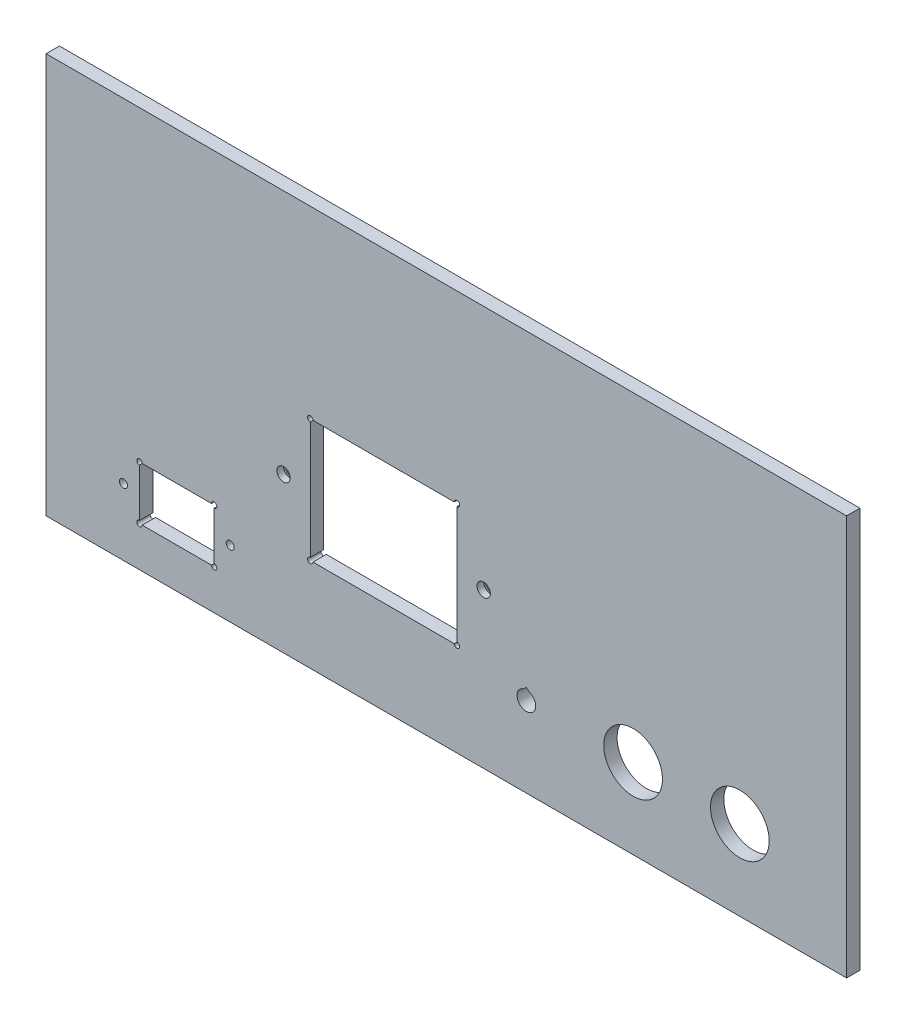
ISO-10303-21;
HEADER;
FILE_DESCRIPTION(('STEP AP214'),'2;1');
FILE_NAME('part.step','',(''),(''),'','','');
FILE_SCHEMA(('AUTOMOTIVE_DESIGN { 1 0 10303 214 1 1 1 1 }'));
ENDSEC;
DATA;
#1=APPLICATION_CONTEXT('core data for automotive mechanical design processes');
#2=APPLICATION_PROTOCOL_DEFINITION('international standard','automotive_design',2000,#1);
#3=PRODUCT_CONTEXT('',#1,'mechanical');
#4=PRODUCT('Part','Part','',(#3));
#5=PRODUCT_RELATED_PRODUCT_CATEGORY('part','',(#4));
#6=PRODUCT_DEFINITION_FORMATION('','',#4);
#7=PRODUCT_DEFINITION_CONTEXT('part definition',#1,'design');
#8=PRODUCT_DEFINITION('design','',#6,#7);
#9=PRODUCT_DEFINITION_SHAPE('','',#8);
#10=(LENGTH_UNIT() NAMED_UNIT(*) SI_UNIT(.MILLI.,.METRE.));
#11=(NAMED_UNIT(*) PLANE_ANGLE_UNIT() SI_UNIT($,.RADIAN.));
#12=(NAMED_UNIT(*) SI_UNIT($,.STERADIAN.) SOLID_ANGLE_UNIT());
#13=UNCERTAINTY_MEASURE_WITH_UNIT(LENGTH_MEASURE(1.E-05),#10,'distance_accuracy_value','');
#14=(GEOMETRIC_REPRESENTATION_CONTEXT(3) GLOBAL_UNCERTAINTY_ASSIGNED_CONTEXT((#13)) GLOBAL_UNIT_ASSIGNED_CONTEXT((#10,
#11,#12)) REPRESENTATION_CONTEXT('',''));
#15=CARTESIAN_POINT('',(0.,0.,0.));
#16=DIRECTION('',(0.,0.,1.));
#17=DIRECTION('',(1.,0.,0.));
#18=AXIS2_PLACEMENT_3D('',#15,#16,#17);
#19=CARTESIAN_POINT('',(150.,75.,5.));
#20=DIRECTION('',(-1.,0.,0.));
#21=DIRECTION('',(0.,-1.,0.));
#22=AXIS2_PLACEMENT_3D('',#19,#20,#21);
#23=PLANE('',#22);
#24=DIRECTION('',(0.,1.,0.));
#25=VECTOR('',#24,1.);
#26=CARTESIAN_POINT('',(150.,75.,0.));
#27=LINE('',#26,#25);
#28=CARTESIAN_POINT('',(150.,-75.,0.));
#29=VERTEX_POINT('',#28);
#30=CARTESIAN_POINT('',(150.,75.,0.));
#31=VERTEX_POINT('',#30);
#32=EDGE_CURVE('E357',#29,#31,#27,.T.);
#33=ORIENTED_EDGE('',*,*,#32,.T.);
#34=DIRECTION('',(0.,0.,-1.));
#35=VECTOR('',#34,1.);
#36=CARTESIAN_POINT('',(150.,75.,5.));
#37=LINE('',#36,#35);
#38=CARTESIAN_POINT('',(150.,75.,5.));
#39=VERTEX_POINT('',#38);
#40=EDGE_CURVE('E393',#39,#31,#37,.T.);
#41=ORIENTED_EDGE('',*,*,#40,.F.);
#42=DIRECTION('',(0.,1.,0.));
#43=VECTOR('',#42,1.);
#44=CARTESIAN_POINT('',(150.,75.,5.));
#45=LINE('',#44,#43);
#46=CARTESIAN_POINT('',(150.,-75.,5.));
#47=VERTEX_POINT('',#46);
#48=EDGE_CURVE('E367',#47,#39,#45,.T.);
#49=ORIENTED_EDGE('',*,*,#48,.F.);
#50=DIRECTION('',(0.,0.,-1.));
#51=VECTOR('',#50,1.);
#52=CARTESIAN_POINT('',(150.,-75.,5.));
#53=LINE('',#52,#51);
#54=EDGE_CURVE('E377',#47,#29,#53,.T.);
#55=ORIENTED_EDGE('',*,*,#54,.T.);
#56=EDGE_LOOP('',(#33,#41,#49,#55));
#57=FACE_BOUND('',#56,.T.);
#58=ADVANCED_FACE('F47',(#57),#23,.F.);
#59=CARTESIAN_POINT('',(-150.,75.,5.));
#60=DIRECTION('',(0.,-1.,0.));
#61=DIRECTION('',(0.,0.,-1.));
#62=AXIS2_PLACEMENT_3D('',#59,#60,#61);
#63=PLANE('',#62);
#64=DIRECTION('',(-1.,0.,0.));
#65=VECTOR('',#64,1.);
#66=CARTESIAN_POINT('',(-150.,75.,0.));
#67=LINE('',#66,#65);
#68=CARTESIAN_POINT('',(-150.,75.,0.));
#69=VERTEX_POINT('',#68);
#70=EDGE_CURVE('E380',#31,#69,#67,.T.);
#71=ORIENTED_EDGE('',*,*,#70,.T.);
#72=DIRECTION('',(0.,0.,-1.));
#73=VECTOR('',#72,1.);
#74=CARTESIAN_POINT('',(-150.,75.,5.));
#75=LINE('',#74,#73);
#76=CARTESIAN_POINT('',(-150.,75.,5.));
#77=VERTEX_POINT('',#76);
#78=EDGE_CURVE('E390',#77,#69,#75,.T.);
#79=ORIENTED_EDGE('',*,*,#78,.F.);
#80=DIRECTION('',(-1.,0.,0.));
#81=VECTOR('',#80,1.);
#82=CARTESIAN_POINT('',(-150.,75.,5.));
#83=LINE('',#82,#81);
#84=EDGE_CURVE('E370',#39,#77,#83,.T.);
#85=ORIENTED_EDGE('',*,*,#84,.F.);
#86=ORIENTED_EDGE('',*,*,#40,.T.);
#87=EDGE_LOOP('',(#71,#79,#85,#86));
#88=FACE_BOUND('',#87,.T.);
#89=ADVANCED_FACE('F450',(#88),#63,.F.);
#90=CARTESIAN_POINT('',(-150.,75.,5.));
#91=DIRECTION('',(1.,0.,0.));
#92=DIRECTION('',(0.,0.,-1.));
#93=AXIS2_PLACEMENT_3D('',#90,#91,#92);
#94=PLANE('',#93);
#95=DIRECTION('',(0.,-1.,0.));
#96=VECTOR('',#95,1.);
#97=CARTESIAN_POINT('',(-150.,75.,0.));
#98=LINE('',#97,#96);
#99=CARTESIAN_POINT('',(-150.,-75.,0.));
#100=VERTEX_POINT('',#99);
#101=EDGE_CURVE('E382',#69,#100,#98,.T.);
#102=ORIENTED_EDGE('',*,*,#101,.T.);
#103=DIRECTION('',(0.,0.,-1.));
#104=VECTOR('',#103,1.);
#105=CARTESIAN_POINT('',(-150.,-75.,5.));
#106=LINE('',#105,#104);
#107=CARTESIAN_POINT('',(-150.,-75.,5.));
#108=VERTEX_POINT('',#107);
#109=EDGE_CURVE('E387',#108,#100,#106,.T.);
#110=ORIENTED_EDGE('',*,*,#109,.F.);
#111=DIRECTION('',(0.,-1.,0.));
#112=VECTOR('',#111,1.);
#113=CARTESIAN_POINT('',(-150.,75.,5.));
#114=LINE('',#113,#112);
#115=EDGE_CURVE('E373',#77,#108,#114,.T.);
#116=ORIENTED_EDGE('',*,*,#115,.F.);
#117=ORIENTED_EDGE('',*,*,#78,.T.);
#118=EDGE_LOOP('',(#102,#110,#116,#117));
#119=FACE_BOUND('',#118,.T.);
#120=ADVANCED_FACE('F456',(#119),#94,.F.);
#121=CARTESIAN_POINT('',(-150.,-75.,5.));
#122=DIRECTION('',(0.,1.,0.));
#123=DIRECTION('',(0.,0.,1.));
#124=AXIS2_PLACEMENT_3D('',#121,#122,#123);
#125=PLANE('',#124);
#126=DIRECTION('',(1.,0.,0.));
#127=VECTOR('',#126,1.);
#128=CARTESIAN_POINT('',(-150.,-75.,0.));
#129=LINE('',#128,#127);
#130=EDGE_CURVE('E371',#100,#29,#129,.T.);
#131=ORIENTED_EDGE('',*,*,#130,.T.);
#132=ORIENTED_EDGE('',*,*,#54,.F.);
#133=DIRECTION('',(1.,0.,0.));
#134=VECTOR('',#133,1.);
#135=CARTESIAN_POINT('',(-150.,-75.,5.));
#136=LINE('',#135,#134);
#137=EDGE_CURVE('E375',#108,#47,#136,.T.);
#138=ORIENTED_EDGE('',*,*,#137,.F.);
#139=ORIENTED_EDGE('',*,*,#109,.T.);
#140=EDGE_LOOP('',(#131,#132,#138,#139));
#141=FACE_BOUND('',#140,.T.);
#142=ADVANCED_FACE('F462',(#141),#125,.F.);
#143=CARTESIAN_POINT('',(0.,0.,5.));
#144=DIRECTION('',(0.,0.,1.));
#145=DIRECTION('',(1.,0.,0.));
#146=AXIS2_PLACEMENT_3D('',#143,#144,#145);
#147=PLANE('',#146);
#148=DIRECTION('',(-0.707106781186548,-0.707106781186548,0.));
#149=VECTOR('',#148,1.);
#150=CARTESIAN_POINT('',(35.3229490168751,-35.3229490168751,5.));
#151=LINE('',#150,#149);
#152=CARTESIAN_POINT('',(30.,-40.6458980337503,5.));
#153=VERTEX_POINT('',#152);
#154=CARTESIAN_POINT('',(29.,-41.6458980337503,5.));
#155=VERTEX_POINT('',#154);
#156=EDGE_CURVE('E62',#153,#155,#151,.T.);
#157=ORIENTED_EDGE('',*,*,#156,.F.);
#158=DIRECTION('',(-0.707106781186548,0.707106781186548,0.));
#159=VECTOR('',#158,1.);
#160=CARTESIAN_POINT('',(-5.32294901687519,-5.32294901687519,5.));
#161=LINE('',#160,#159);
#162=CARTESIAN_POINT('',(31.,-41.6458980337503,5.));
#163=VERTEX_POINT('',#162);
#164=EDGE_CURVE('E204',#163,#153,#161,.T.);
#165=ORIENTED_EDGE('',*,*,#164,.F.);
#166=CARTESIAN_POINT('',(30.,-45.,5.));
#167=DIRECTION('',(0.,0.,1.));
#168=DIRECTION('',(1.,0.,0.));
#169=AXIS2_PLACEMENT_3D('',#166,#167,#168);
#170=CIRCLE('',#169,3.5);
#171=EDGE_CURVE('E226',#155,#163,#170,.T.);
#172=ORIENTED_EDGE('',*,*,#171,.F.);
#173=EDGE_LOOP('',(#157,#165,#172));
#174=FACE_BOUND('',#173,.T.);
#175=CARTESIAN_POINT('',(3.99999999999996,5.99999999999999,5.));
#176=DIRECTION('',(0.,0.,1.));
#177=DIRECTION('',(1.,0.,0.));
#178=AXIS2_PLACEMENT_3D('',#175,#176,#177);
#179=CIRCLE('',#178,1.);
#180=CARTESIAN_POINT('',(3.99999999999996,4.99999999999999,5.));
#181=VERTEX_POINT('',#180);
#182=CARTESIAN_POINT('',(2.99999999999995,5.99999999999999,5.));
#183=VERTEX_POINT('',#182);
#184=EDGE_CURVE('E233',#181,#183,#179,.T.);
#185=ORIENTED_EDGE('',*,*,#184,.F.);
#186=DIRECTION('',(0.,1.,0.));
#187=VECTOR('',#186,1.);
#188=CARTESIAN_POINT('',(3.99999999999996,-40.,5.));
#189=LINE('',#188,#187);
#190=CARTESIAN_POINT('',(3.99999999999996,-39.,5.));
#191=VERTEX_POINT('',#190);
#192=EDGE_CURVE('E285',#191,#181,#189,.T.);
#193=ORIENTED_EDGE('',*,*,#192,.F.);
#194=CARTESIAN_POINT('',(3.99999999999996,-40.,5.));
#195=DIRECTION('',(0.,0.,1.));
#196=DIRECTION('',(1.,0.,0.));
#197=AXIS2_PLACEMENT_3D('',#194,#195,#196);
#198=CIRCLE('',#197,1.);
#199=CARTESIAN_POINT('',(2.99999999999995,-40.,5.));
#200=VERTEX_POINT('',#199);
#201=EDGE_CURVE('E238',#200,#191,#198,.T.);
#202=ORIENTED_EDGE('',*,*,#201,.F.);
#203=DIRECTION('',(1.,0.,0.));
#204=VECTOR('',#203,1.);
#205=CARTESIAN_POINT('',(-51.,-40.,5.));
#206=LINE('',#205,#204);
#207=CARTESIAN_POINT('',(-50.,-40.,5.));
#208=VERTEX_POINT('',#207);
#209=EDGE_CURVE('E282',#208,#200,#206,.T.);
#210=ORIENTED_EDGE('',*,*,#209,.F.);
#211=CARTESIAN_POINT('',(-51.,-40.,5.));
#212=DIRECTION('',(0.,0.,1.));
#213=DIRECTION('',(1.,0.,0.));
#214=AXIS2_PLACEMENT_3D('',#211,#212,#213);
#215=CIRCLE('',#214,0.999999999999998);
#216=CARTESIAN_POINT('',(-51.,-39.,5.));
#217=VERTEX_POINT('',#216);
#218=EDGE_CURVE('E222',#217,#208,#215,.T.);
#219=ORIENTED_EDGE('',*,*,#218,.F.);
#220=DIRECTION('',(0.,-1.,0.));
#221=VECTOR('',#220,1.);
#222=CARTESIAN_POINT('',(-51.,-40.,5.));
#223=LINE('',#222,#221);
#224=CARTESIAN_POINT('',(-51.,4.99999999999999,5.));
#225=VERTEX_POINT('',#224);
#226=EDGE_CURVE('E264',#225,#217,#223,.T.);
#227=ORIENTED_EDGE('',*,*,#226,.F.);
#228=CARTESIAN_POINT('',(-51.,5.99999999999999,5.));
#229=DIRECTION('',(0.,0.,1.));
#230=DIRECTION('',(1.,0.,0.));
#231=AXIS2_PLACEMENT_3D('',#228,#229,#230);
#232=CIRCLE('',#231,0.999999999999998);
#233=CARTESIAN_POINT('',(-50.,5.99999999999999,5.));
#234=VERTEX_POINT('',#233);
#235=EDGE_CURVE('E252',#234,#225,#232,.T.);
#236=ORIENTED_EDGE('',*,*,#235,.F.);
#237=DIRECTION('',(-1.,0.,0.));
#238=VECTOR('',#237,1.);
#239=CARTESIAN_POINT('',(-51.,5.99999999999999,5.));
#240=LINE('',#239,#238);
#241=EDGE_CURVE('E271',#183,#234,#240,.T.);
#242=ORIENTED_EDGE('',*,*,#241,.F.);
#243=EDGE_LOOP('',(#185,#193,#202,#210,#219,#227,#236,#242));
#244=FACE_BOUND('',#243,.T.);
#245=CARTESIAN_POINT('',(-61.0000000000001,-17.,5.));
#246=DIRECTION('',(0.,0.,1.));
#247=DIRECTION('',(1.,0.,0.));
#248=AXIS2_PLACEMENT_3D('',#245,#246,#247);
#249=CIRCLE('',#248,2.5);
#250=CARTESIAN_POINT('',(-58.5,-17.,5.));
#251=VERTEX_POINT('',#250);
#252=EDGE_CURVE('E261',#251,#251,#249,.T.);
#253=ORIENTED_EDGE('',*,*,#252,.F.);
#254=EDGE_LOOP('',(#253));
#255=FACE_BOUND('',#254,.T.);
#256=CARTESIAN_POINT('',(14.,-17.,5.));
#257=DIRECTION('',(0.,0.,1.));
#258=DIRECTION('',(1.,0.,0.));
#259=AXIS2_PLACEMENT_3D('',#256,#257,#258);
#260=CIRCLE('',#259,2.5);
#261=CARTESIAN_POINT('',(16.5,-17.,5.));
#262=VERTEX_POINT('',#261);
#263=EDGE_CURVE('E260',#262,#262,#260,.T.);
#264=ORIENTED_EDGE('',*,*,#263,.F.);
#265=EDGE_LOOP('',(#264));
#266=FACE_BOUND('',#265,.T.);
#267=CARTESIAN_POINT('',(-87.,-40.,5.));
#268=DIRECTION('',(0.,0.,1.));
#269=DIRECTION('',(1.,0.,0.));
#270=AXIS2_PLACEMENT_3D('',#267,#268,#269);
#271=CIRCLE('',#270,0.999999999999998);
#272=CARTESIAN_POINT('',(-87.,-41.,5.));
#273=VERTEX_POINT('',#272);
#274=CARTESIAN_POINT('',(-88.0000000000001,-40.,5.));
#275=VERTEX_POINT('',#274);
#276=EDGE_CURVE('E293',#273,#275,#271,.T.);
#277=ORIENTED_EDGE('',*,*,#276,.F.);
#278=DIRECTION('',(0.,1.,0.));
#279=VECTOR('',#278,1.);
#280=CARTESIAN_POINT('',(-87.,-40.,5.));
#281=LINE('',#280,#279);
#282=CARTESIAN_POINT('',(-87.,-59.,5.));
#283=VERTEX_POINT('',#282);
#284=EDGE_CURVE('E336',#283,#273,#281,.T.);
#285=ORIENTED_EDGE('',*,*,#284,.F.);
#286=CARTESIAN_POINT('',(-87.,-60.,5.));
#287=DIRECTION('',(0.,0.,1.));
#288=DIRECTION('',(1.,0.,0.));
#289=AXIS2_PLACEMENT_3D('',#286,#287,#288);
#290=CIRCLE('',#289,0.999999999999998);
#291=CARTESIAN_POINT('',(-88.0000000000001,-60.,5.));
#292=VERTEX_POINT('',#291);
#293=EDGE_CURVE('E298',#292,#283,#290,.T.);
#294=ORIENTED_EDGE('',*,*,#293,.F.);
#295=DIRECTION('',(1.,0.,0.));
#296=VECTOR('',#295,1.);
#297=CARTESIAN_POINT('',(-115.,-60.,5.));
#298=LINE('',#297,#296);
#299=CARTESIAN_POINT('',(-114.,-60.,5.));
#300=VERTEX_POINT('',#299);
#301=EDGE_CURVE('E349',#300,#292,#298,.T.);
#302=ORIENTED_EDGE('',*,*,#301,.F.);
#303=CARTESIAN_POINT('',(-115.,-60.,5.));
#304=DIRECTION('',(0.,0.,1.));
#305=DIRECTION('',(1.,0.,0.));
#306=AXIS2_PLACEMENT_3D('',#303,#304,#305);
#307=CIRCLE('',#306,0.999999999999998);
#308=CARTESIAN_POINT('',(-115.,-59.,5.));
#309=VERTEX_POINT('',#308);
#310=EDGE_CURVE('E279',#309,#300,#307,.T.);
#311=ORIENTED_EDGE('',*,*,#310,.F.);
#312=DIRECTION('',(0.,-1.,0.));
#313=VECTOR('',#312,1.);
#314=CARTESIAN_POINT('',(-115.,-40.,5.));
#315=LINE('',#314,#313);
#316=CARTESIAN_POINT('',(-115.,-41.,5.));
#317=VERTEX_POINT('',#316);
#318=EDGE_CURVE('E362',#317,#309,#315,.T.);
#319=ORIENTED_EDGE('',*,*,#318,.F.);
#320=CARTESIAN_POINT('',(-115.,-40.,5.));
#321=DIRECTION('',(0.,0.,1.));
#322=DIRECTION('',(1.,0.,0.));
#323=AXIS2_PLACEMENT_3D('',#320,#321,#322);
#324=CIRCLE('',#323,0.999999999999998);
#325=CARTESIAN_POINT('',(-114.,-40.,5.));
#326=VERTEX_POINT('',#325);
#327=EDGE_CURVE('E312',#326,#317,#324,.T.);
#328=ORIENTED_EDGE('',*,*,#327,.F.);
#329=DIRECTION('',(-1.,0.,0.));
#330=VECTOR('',#329,1.);
#331=CARTESIAN_POINT('',(-115.,-40.,5.));
#332=LINE('',#331,#330);
#333=EDGE_CURVE('E360',#275,#326,#332,.T.);
#334=ORIENTED_EDGE('',*,*,#333,.F.);
#335=EDGE_LOOP('',(#277,#285,#294,#302,#311,#319,#328,#334));
#336=FACE_BOUND('',#335,.T.);
#337=CARTESIAN_POINT('',(70.,-45.,5.));
#338=DIRECTION('',(0.,0.,1.));
#339=DIRECTION('',(1.,0.,0.));
#340=AXIS2_PLACEMENT_3D('',#337,#338,#339);
#341=CIRCLE('',#340,11.);
#342=CARTESIAN_POINT('',(81.,-45.,5.));
#343=VERTEX_POINT('',#342);
#344=EDGE_CURVE('E320',#343,#343,#341,.T.);
#345=ORIENTED_EDGE('',*,*,#344,.F.);
#346=EDGE_LOOP('',(#345));
#347=FACE_BOUND('',#346,.T.);
#348=CARTESIAN_POINT('',(110.,-45.,5.));
#349=DIRECTION('',(0.,0.,1.));
#350=DIRECTION('',(1.,0.,0.));
#351=AXIS2_PLACEMENT_3D('',#348,#349,#350);
#352=CIRCLE('',#351,11.);
#353=CARTESIAN_POINT('',(121.,-45.,5.));
#354=VERTEX_POINT('',#353);
#355=EDGE_CURVE('E324',#354,#354,#352,.T.);
#356=ORIENTED_EDGE('',*,*,#355,.F.);
#357=EDGE_LOOP('',(#356));
#358=FACE_BOUND('',#357,.T.);
#359=CARTESIAN_POINT('',(-121.,-50.,5.));
#360=DIRECTION('',(0.,0.,1.));
#361=DIRECTION('',(1.,0.,0.));
#362=AXIS2_PLACEMENT_3D('',#359,#360,#361);
#363=CIRCLE('',#362,1.5);
#364=CARTESIAN_POINT('',(-119.5,-50.,5.));
#365=VERTEX_POINT('',#364);
#366=EDGE_CURVE('E337',#365,#365,#363,.T.);
#367=ORIENTED_EDGE('',*,*,#366,.F.);
#368=EDGE_LOOP('',(#367));
#369=FACE_BOUND('',#368,.T.);
#370=CARTESIAN_POINT('',(-81.,-50.,5.));
#371=DIRECTION('',(0.,0.,1.));
#372=DIRECTION('',(1.,0.,0.));
#373=AXIS2_PLACEMENT_3D('',#370,#371,#372);
#374=CIRCLE('',#373,1.5);
#375=CARTESIAN_POINT('',(-79.5,-50.,5.));
#376=VERTEX_POINT('',#375);
#377=EDGE_CURVE('E330',#376,#376,#374,.T.);
#378=ORIENTED_EDGE('',*,*,#377,.F.);
#379=EDGE_LOOP('',(#378));
#380=FACE_BOUND('',#379,.T.);
#381=ORIENTED_EDGE('',*,*,#48,.T.);
#382=ORIENTED_EDGE('',*,*,#84,.T.);
#383=ORIENTED_EDGE('',*,*,#115,.T.);
#384=ORIENTED_EDGE('',*,*,#137,.T.);
#385=EDGE_LOOP('',(#381,#382,#383,#384));
#386=FACE_BOUND('',#385,.T.);
#387=ADVANCED_FACE('F440',(#174,#244,#255,#266,#336,#347,#358,#369,#380,#386),#147,.T.);
#388=CARTESIAN_POINT('',(0.,0.,0.));
#389=DIRECTION('',(0.,0.,1.));
#390=DIRECTION('',(1.,0.,0.));
#391=AXIS2_PLACEMENT_3D('',#388,#389,#390);
#392=PLANE('',#391);
#393=CARTESIAN_POINT('',(-61.0000000000001,-17.,0.));
#394=DIRECTION('',(0.,0.,1.));
#395=DIRECTION('',(1.,0.,0.));
#396=AXIS2_PLACEMENT_3D('',#393,#394,#395);
#397=CIRCLE('',#396,5.00000000000003);
#398=CARTESIAN_POINT('',(-66.0000000000001,-17.,0.));
#399=VERTEX_POINT('',#398);
#400=EDGE_CURVE('E423',#399,#399,#397,.T.);
#401=ORIENTED_EDGE('',*,*,#400,.T.);
#402=EDGE_LOOP('',(#401));
#403=FACE_BOUND('',#402,.T.);
#404=CARTESIAN_POINT('',(14.,-17.,0.));
#405=DIRECTION('',(0.,0.,1.));
#406=DIRECTION('',(1.,0.,0.));
#407=AXIS2_PLACEMENT_3D('',#404,#405,#406);
#408=CIRCLE('',#407,5.00000000000003);
#409=CARTESIAN_POINT('',(19.,-17.,0.));
#410=VERTEX_POINT('',#409);
#411=EDGE_CURVE('E420',#410,#410,#408,.T.);
#412=ORIENTED_EDGE('',*,*,#411,.T.);
#413=EDGE_LOOP('',(#412));
#414=FACE_BOUND('',#413,.T.);
#415=DIRECTION('',(-0.707106781186548,0.707106781186548,0.));
#416=VECTOR('',#415,1.);
#417=CARTESIAN_POINT('',(-5.32294901687519,-5.32294901687519,0.));
#418=LINE('',#417,#416);
#419=CARTESIAN_POINT('',(31.,-41.6458980337503,0.));
#420=VERTEX_POINT('',#419);
#421=CARTESIAN_POINT('',(30.,-40.6458980337503,0.));
#422=VERTEX_POINT('',#421);
#423=EDGE_CURVE('E70',#420,#422,#418,.T.);
#424=ORIENTED_EDGE('',*,*,#423,.T.);
#425=DIRECTION('',(-0.707106781186548,-0.707106781186548,0.));
#426=VECTOR('',#425,1.);
#427=CARTESIAN_POINT('',(35.3229490168751,-35.3229490168751,0.));
#428=LINE('',#427,#426);
#429=CARTESIAN_POINT('',(29.,-41.6458980337503,0.));
#430=VERTEX_POINT('',#429);
#431=EDGE_CURVE('E209',#422,#430,#428,.T.);
#432=ORIENTED_EDGE('',*,*,#431,.T.);
#433=CARTESIAN_POINT('',(30.,-45.,0.));
#434=DIRECTION('',(0.,0.,1.));
#435=DIRECTION('',(1.,0.,0.));
#436=AXIS2_PLACEMENT_3D('',#433,#434,#435);
#437=CIRCLE('',#436,3.5);
#438=EDGE_CURVE('E217',#430,#420,#437,.T.);
#439=ORIENTED_EDGE('',*,*,#438,.T.);
#440=EDGE_LOOP('',(#424,#432,#439));
#441=FACE_BOUND('',#440,.T.);
#442=DIRECTION('',(0.,1.,0.));
#443=VECTOR('',#442,1.);
#444=CARTESIAN_POINT('',(3.99999999999996,-40.,0.));
#445=LINE('',#444,#443);
#446=CARTESIAN_POINT('',(3.99999999999996,-39.,0.));
#447=VERTEX_POINT('',#446);
#448=CARTESIAN_POINT('',(3.99999999999996,4.99999999999999,0.));
#449=VERTEX_POINT('',#448);
#450=EDGE_CURVE('E274',#447,#449,#445,.T.);
#451=ORIENTED_EDGE('',*,*,#450,.T.);
#452=CARTESIAN_POINT('',(3.99999999999996,5.99999999999999,0.));
#453=DIRECTION('',(0.,0.,1.));
#454=DIRECTION('',(1.,0.,0.));
#455=AXIS2_PLACEMENT_3D('',#452,#453,#454);
#456=CIRCLE('',#455,1.);
#457=CARTESIAN_POINT('',(2.99999999999995,5.99999999999999,0.));
#458=VERTEX_POINT('',#457);
#459=EDGE_CURVE('E229',#449,#458,#456,.T.);
#460=ORIENTED_EDGE('',*,*,#459,.T.);
#461=DIRECTION('',(-1.,0.,0.));
#462=VECTOR('',#461,1.);
#463=CARTESIAN_POINT('',(-51.,5.99999999999999,0.));
#464=LINE('',#463,#462);
#465=CARTESIAN_POINT('',(-50.,5.99999999999999,0.));
#466=VERTEX_POINT('',#465);
#467=EDGE_CURVE('E277',#458,#466,#464,.T.);
#468=ORIENTED_EDGE('',*,*,#467,.T.);
#469=CARTESIAN_POINT('',(-51.,5.99999999999999,0.));
#470=DIRECTION('',(0.,0.,1.));
#471=DIRECTION('',(1.,0.,0.));
#472=AXIS2_PLACEMENT_3D('',#469,#470,#471);
#473=CIRCLE('',#472,0.999999999999998);
#474=CARTESIAN_POINT('',(-51.,4.99999999999999,0.));
#475=VERTEX_POINT('',#474);
#476=EDGE_CURVE('E253',#466,#475,#473,.T.);
#477=ORIENTED_EDGE('',*,*,#476,.T.);
#478=DIRECTION('',(0.,-1.,0.));
#479=VECTOR('',#478,1.);
#480=CARTESIAN_POINT('',(-51.,-40.,0.));
#481=LINE('',#480,#479);
#482=CARTESIAN_POINT('',(-51.,-39.,0.));
#483=VERTEX_POINT('',#482);
#484=EDGE_CURVE('E267',#475,#483,#481,.T.);
#485=ORIENTED_EDGE('',*,*,#484,.T.);
#486=CARTESIAN_POINT('',(-51.,-40.,0.));
#487=DIRECTION('',(0.,0.,1.));
#488=DIRECTION('',(1.,0.,0.));
#489=AXIS2_PLACEMENT_3D('',#486,#487,#488);
#490=CIRCLE('',#489,0.999999999999998);
#491=CARTESIAN_POINT('',(-50.,-40.,0.));
#492=VERTEX_POINT('',#491);
#493=EDGE_CURVE('E240',#483,#492,#490,.T.);
#494=ORIENTED_EDGE('',*,*,#493,.T.);
#495=DIRECTION('',(1.,0.,0.));
#496=VECTOR('',#495,1.);
#497=CARTESIAN_POINT('',(-51.,-40.,0.));
#498=LINE('',#497,#496);
#499=CARTESIAN_POINT('',(2.99999999999995,-40.,0.));
#500=VERTEX_POINT('',#499);
#501=EDGE_CURVE('E270',#492,#500,#498,.T.);
#502=ORIENTED_EDGE('',*,*,#501,.T.);
#503=CARTESIAN_POINT('',(3.99999999999996,-40.,0.));
#504=DIRECTION('',(0.,0.,1.));
#505=DIRECTION('',(1.,0.,0.));
#506=AXIS2_PLACEMENT_3D('',#503,#504,#505);
#507=CIRCLE('',#506,1.);
#508=EDGE_CURVE('E235',#500,#447,#507,.T.);
#509=ORIENTED_EDGE('',*,*,#508,.T.);
#510=EDGE_LOOP('',(#451,#460,#468,#477,#485,#494,#502,#509));
#511=FACE_BOUND('',#510,.T.);
#512=CARTESIAN_POINT('',(70.,-45.,0.));
#513=DIRECTION('',(0.,0.,1.));
#514=DIRECTION('',(1.,0.,0.));
#515=AXIS2_PLACEMENT_3D('',#512,#513,#514);
#516=CIRCLE('',#515,11.);
#517=CARTESIAN_POINT('',(81.,-45.,0.));
#518=VERTEX_POINT('',#517);
#519=EDGE_CURVE('E321',#518,#518,#516,.T.);
#520=ORIENTED_EDGE('',*,*,#519,.T.);
#521=EDGE_LOOP('',(#520));
#522=FACE_BOUND('',#521,.T.);
#523=CARTESIAN_POINT('',(110.,-45.,0.));
#524=DIRECTION('',(0.,0.,1.));
#525=DIRECTION('',(1.,0.,0.));
#526=AXIS2_PLACEMENT_3D('',#523,#524,#525);
#527=CIRCLE('',#526,11.);
#528=CARTESIAN_POINT('',(121.,-45.,0.));
#529=VERTEX_POINT('',#528);
#530=EDGE_CURVE('E327',#529,#529,#527,.T.);
#531=ORIENTED_EDGE('',*,*,#530,.T.);
#532=EDGE_LOOP('',(#531));
#533=FACE_BOUND('',#532,.T.);
#534=CARTESIAN_POINT('',(-121.,-50.,0.));
#535=DIRECTION('',(0.,0.,1.));
#536=DIRECTION('',(1.,0.,0.));
#537=AXIS2_PLACEMENT_3D('',#534,#535,#536);
#538=CIRCLE('',#537,1.5);
#539=CARTESIAN_POINT('',(-119.5,-50.,0.));
#540=VERTEX_POINT('',#539);
#541=EDGE_CURVE('E333',#540,#540,#538,.T.);
#542=ORIENTED_EDGE('',*,*,#541,.T.);
#543=EDGE_LOOP('',(#542));
#544=FACE_BOUND('',#543,.T.);
#545=CARTESIAN_POINT('',(-81.,-50.,0.));
#546=DIRECTION('',(0.,0.,1.));
#547=DIRECTION('',(1.,0.,0.));
#548=AXIS2_PLACEMENT_3D('',#545,#546,#547);
#549=CIRCLE('',#548,1.5);
#550=CARTESIAN_POINT('',(-79.5,-50.,0.));
#551=VERTEX_POINT('',#550);
#552=EDGE_CURVE('E340',#551,#551,#549,.T.);
#553=ORIENTED_EDGE('',*,*,#552,.T.);
#554=EDGE_LOOP('',(#553));
#555=FACE_BOUND('',#554,.T.);
#556=DIRECTION('',(0.,1.,0.));
#557=VECTOR('',#556,1.);
#558=CARTESIAN_POINT('',(-87.,-40.,0.));
#559=LINE('',#558,#557);
#560=CARTESIAN_POINT('',(-87.,-59.,0.));
#561=VERTEX_POINT('',#560);
#562=CARTESIAN_POINT('',(-87.,-41.,0.));
#563=VERTEX_POINT('',#562);
#564=EDGE_CURVE('E345',#561,#563,#559,.T.);
#565=ORIENTED_EDGE('',*,*,#564,.T.);
#566=CARTESIAN_POINT('',(-87.,-40.,0.));
#567=DIRECTION('',(0.,0.,1.));
#568=DIRECTION('',(1.,0.,0.));
#569=AXIS2_PLACEMENT_3D('',#566,#567,#568);
#570=CIRCLE('',#569,0.999999999999998);
#571=CARTESIAN_POINT('',(-88.0000000000001,-40.,0.));
#572=VERTEX_POINT('',#571);
#573=EDGE_CURVE('E289',#563,#572,#570,.T.);
#574=ORIENTED_EDGE('',*,*,#573,.T.);
#575=DIRECTION('',(-1.,0.,0.));
#576=VECTOR('',#575,1.);
#577=CARTESIAN_POINT('',(-115.,-40.,0.));
#578=LINE('',#577,#576);
#579=CARTESIAN_POINT('',(-114.,-40.,0.));
#580=VERTEX_POINT('',#579);
#581=EDGE_CURVE('E348',#572,#580,#578,.T.);
#582=ORIENTED_EDGE('',*,*,#581,.T.);
#583=CARTESIAN_POINT('',(-115.,-40.,0.));
#584=DIRECTION('',(0.,0.,1.));
#585=DIRECTION('',(1.,0.,0.));
#586=AXIS2_PLACEMENT_3D('',#583,#584,#585);
#587=CIRCLE('',#586,0.999999999999998);
#588=CARTESIAN_POINT('',(-115.,-41.,0.));
#589=VERTEX_POINT('',#588);
#590=EDGE_CURVE('E313',#580,#589,#587,.T.);
#591=ORIENTED_EDGE('',*,*,#590,.T.);
#592=DIRECTION('',(0.,-1.,0.));
#593=VECTOR('',#592,1.);
#594=CARTESIAN_POINT('',(-115.,-40.,0.));
#595=LINE('',#594,#593);
#596=CARTESIAN_POINT('',(-115.,-59.,0.));
#597=VERTEX_POINT('',#596);
#598=EDGE_CURVE('E351',#589,#597,#595,.T.);
#599=ORIENTED_EDGE('',*,*,#598,.T.);
#600=CARTESIAN_POINT('',(-115.,-60.,0.));
#601=DIRECTION('',(0.,0.,1.));
#602=DIRECTION('',(1.,0.,0.));
#603=AXIS2_PLACEMENT_3D('',#600,#601,#602);
#604=CIRCLE('',#603,0.999999999999998);
#605=CARTESIAN_POINT('',(-114.,-60.,0.));
#606=VERTEX_POINT('',#605);
#607=EDGE_CURVE('E300',#597,#606,#604,.T.);
#608=ORIENTED_EDGE('',*,*,#607,.T.);
#609=DIRECTION('',(1.,0.,0.));
#610=VECTOR('',#609,1.);
#611=CARTESIAN_POINT('',(-115.,-60.,0.));
#612=LINE('',#611,#610);
#613=CARTESIAN_POINT('',(-88.0000000000001,-60.,0.));
#614=VERTEX_POINT('',#613);
#615=EDGE_CURVE('E354',#606,#614,#612,.T.);
#616=ORIENTED_EDGE('',*,*,#615,.T.);
#617=CARTESIAN_POINT('',(-87.,-60.,0.));
#618=DIRECTION('',(0.,0.,1.));
#619=DIRECTION('',(1.,0.,0.));
#620=AXIS2_PLACEMENT_3D('',#617,#618,#619);
#621=CIRCLE('',#620,0.999999999999998);
#622=EDGE_CURVE('E295',#614,#561,#621,.T.);
#623=ORIENTED_EDGE('',*,*,#622,.T.);
#624=EDGE_LOOP('',(#565,#574,#582,#591,#599,#608,#616,#623));
#625=FACE_BOUND('',#624,.T.);
#626=ORIENTED_EDGE('',*,*,#32,.F.);
#627=ORIENTED_EDGE('',*,*,#130,.F.);
#628=ORIENTED_EDGE('',*,*,#101,.F.);
#629=ORIENTED_EDGE('',*,*,#70,.F.);
#630=EDGE_LOOP('',(#626,#627,#628,#629));
#631=FACE_BOUND('',#630,.T.);
#632=ADVANCED_FACE('F215',(#403,#414,#441,#511,#522,#533,#544,#555,#625,#631),#392,.F.);
#633=CARTESIAN_POINT('',(-87.,-40.,0.));
#634=DIRECTION('',(1.,0.,0.));
#635=DIRECTION('',(0.,0.,-1.));
#636=AXIS2_PLACEMENT_3D('',#633,#634,#635);
#637=PLANE('',#636);
#638=ORIENTED_EDGE('',*,*,#284,.T.);
#639=DIRECTION('',(0.,0.,1.));
#640=VECTOR('',#639,1.);
#641=CARTESIAN_POINT('',(-87.,-41.,0.));
#642=LINE('',#641,#640);
#643=EDGE_CURVE('E292',#273,#563,#642,.F.);
#644=ORIENTED_EDGE('',*,*,#643,.T.);
#645=ORIENTED_EDGE('',*,*,#564,.F.);
#646=DIRECTION('',(0.,0.,1.));
#647=VECTOR('',#646,1.);
#648=CARTESIAN_POINT('',(-87.,-59.,0.));
#649=LINE('',#648,#647);
#650=EDGE_CURVE('E309',#561,#283,#649,.T.);
#651=ORIENTED_EDGE('',*,*,#650,.T.);
#652=EDGE_LOOP('',(#638,#644,#645,#651));
#653=FACE_BOUND('',#652,.T.);
#654=ADVANCED_FACE('F439',(#653),#637,.F.);
#655=CARTESIAN_POINT('',(-115.,-60.,0.));
#656=DIRECTION('',(0.,-1.,0.));
#657=DIRECTION('',(0.,0.,-1.));
#658=AXIS2_PLACEMENT_3D('',#655,#656,#657);
#659=PLANE('',#658);
#660=ORIENTED_EDGE('',*,*,#301,.T.);
#661=DIRECTION('',(0.,0.,1.));
#662=VECTOR('',#661,1.);
#663=CARTESIAN_POINT('',(-88.0000000000001,-60.,0.));
#664=LINE('',#663,#662);
#665=EDGE_CURVE('E405',#292,#614,#664,.F.);
#666=ORIENTED_EDGE('',*,*,#665,.T.);
#667=ORIENTED_EDGE('',*,*,#615,.F.);
#668=DIRECTION('',(0.,0.,1.));
#669=VECTOR('',#668,1.);
#670=CARTESIAN_POINT('',(-114.,-60.,0.));
#671=LINE('',#670,#669);
#672=EDGE_CURVE('E306',#606,#300,#671,.T.);
#673=ORIENTED_EDGE('',*,*,#672,.T.);
#674=EDGE_LOOP('',(#660,#666,#667,#673));
#675=FACE_BOUND('',#674,.T.);
#676=ADVANCED_FACE('F472',(#675),#659,.F.);
#677=CARTESIAN_POINT('',(-115.,-40.,0.));
#678=DIRECTION('',(-1.,0.,0.));
#679=DIRECTION('',(0.,0.,1.));
#680=AXIS2_PLACEMENT_3D('',#677,#678,#679);
#681=PLANE('',#680);
#682=ORIENTED_EDGE('',*,*,#318,.T.);
#683=DIRECTION('',(0.,0.,1.));
#684=VECTOR('',#683,1.);
#685=CARTESIAN_POINT('',(-115.,-59.,0.));
#686=LINE('',#685,#684);
#687=EDGE_CURVE('E402',#309,#597,#686,.F.);
#688=ORIENTED_EDGE('',*,*,#687,.T.);
#689=ORIENTED_EDGE('',*,*,#598,.F.);
#690=DIRECTION('',(0.,0.,1.));
#691=VECTOR('',#690,1.);
#692=CARTESIAN_POINT('',(-115.,-41.,0.));
#693=LINE('',#692,#691);
#694=EDGE_CURVE('E316',#589,#317,#693,.T.);
#695=ORIENTED_EDGE('',*,*,#694,.T.);
#696=EDGE_LOOP('',(#682,#688,#689,#695));
#697=FACE_BOUND('',#696,.T.);
#698=ADVANCED_FACE('F478',(#697),#681,.F.);
#699=CARTESIAN_POINT('',(-115.,-40.,0.));
#700=DIRECTION('',(0.,1.,0.));
#701=DIRECTION('',(0.,0.,1.));
#702=AXIS2_PLACEMENT_3D('',#699,#700,#701);
#703=PLANE('',#702);
#704=ORIENTED_EDGE('',*,*,#581,.F.);
#705=DIRECTION('',(0.,0.,1.));
#706=VECTOR('',#705,1.);
#707=CARTESIAN_POINT('',(-88.0000000000001,-40.,0.));
#708=LINE('',#707,#706);
#709=EDGE_CURVE('E399',#572,#275,#708,.T.);
#710=ORIENTED_EDGE('',*,*,#709,.T.);
#711=ORIENTED_EDGE('',*,*,#333,.T.);
#712=DIRECTION('',(0.,0.,1.));
#713=VECTOR('',#712,1.);
#714=CARTESIAN_POINT('',(-114.,-40.,0.));
#715=LINE('',#714,#713);
#716=EDGE_CURVE('E396',#326,#580,#715,.F.);
#717=ORIENTED_EDGE('',*,*,#716,.T.);
#718=EDGE_LOOP('',(#704,#710,#711,#717));
#719=FACE_BOUND('',#718,.T.);
#720=ADVANCED_FACE('F474',(#719),#703,.F.);
#721=CARTESIAN_POINT('',(-81.,-50.,0.));
#722=DIRECTION('',(0.,0.,1.));
#723=DIRECTION('',(1.,0.,0.));
#724=AXIS2_PLACEMENT_3D('',#721,#722,#723);
#725=CYLINDRICAL_SURFACE('',#724,1.5);
#726=ORIENTED_EDGE('',*,*,#552,.F.);
#727=EDGE_LOOP('',(#726));
#728=FACE_BOUND('',#727,.T.);
#729=ORIENTED_EDGE('',*,*,#377,.T.);
#730=EDGE_LOOP('',(#729));
#731=FACE_BOUND('',#730,.T.);
#732=ADVANCED_FACE('F477',(#728,#731),#725,.F.);
#733=CARTESIAN_POINT('',(-121.,-50.,0.));
#734=DIRECTION('',(0.,0.,1.));
#735=DIRECTION('',(1.,0.,0.));
#736=AXIS2_PLACEMENT_3D('',#733,#734,#735);
#737=CYLINDRICAL_SURFACE('',#736,1.5);
#738=ORIENTED_EDGE('',*,*,#541,.F.);
#739=EDGE_LOOP('',(#738));
#740=FACE_BOUND('',#739,.T.);
#741=ORIENTED_EDGE('',*,*,#366,.T.);
#742=EDGE_LOOP('',(#741));
#743=FACE_BOUND('',#742,.T.);
#744=ADVANCED_FACE('F488',(#740,#743),#737,.F.);
#745=CARTESIAN_POINT('',(110.,-45.,0.));
#746=DIRECTION('',(0.,0.,1.));
#747=DIRECTION('',(1.,0.,0.));
#748=AXIS2_PLACEMENT_3D('',#745,#746,#747);
#749=CYLINDRICAL_SURFACE('',#748,11.);
#750=ORIENTED_EDGE('',*,*,#530,.F.);
#751=EDGE_LOOP('',(#750));
#752=FACE_BOUND('',#751,.T.);
#753=ORIENTED_EDGE('',*,*,#355,.T.);
#754=EDGE_LOOP('',(#753));
#755=FACE_BOUND('',#754,.T.);
#756=ADVANCED_FACE('F492',(#752,#755),#749,.F.);
#757=CARTESIAN_POINT('',(70.,-45.,0.));
#758=DIRECTION('',(0.,0.,1.));
#759=DIRECTION('',(1.,0.,0.));
#760=AXIS2_PLACEMENT_3D('',#757,#758,#759);
#761=CYLINDRICAL_SURFACE('',#760,11.);
#762=ORIENTED_EDGE('',*,*,#519,.F.);
#763=EDGE_LOOP('',(#762));
#764=FACE_BOUND('',#763,.T.);
#765=ORIENTED_EDGE('',*,*,#344,.T.);
#766=EDGE_LOOP('',(#765));
#767=FACE_BOUND('',#766,.T.);
#768=ADVANCED_FACE('F496',(#764,#767),#761,.F.);
#769=CARTESIAN_POINT('',(-115.,-40.,0.));
#770=DIRECTION('',(0.,0.,1.));
#771=DIRECTION('',(1.,0.,0.));
#772=AXIS2_PLACEMENT_3D('',#769,#770,#771);
#773=CYLINDRICAL_SURFACE('',#772,0.999999999999998);
#774=ORIENTED_EDGE('',*,*,#590,.F.);
#775=ORIENTED_EDGE('',*,*,#716,.F.);
#776=ORIENTED_EDGE('',*,*,#327,.T.);
#777=ORIENTED_EDGE('',*,*,#694,.F.);
#778=EDGE_LOOP('',(#774,#775,#776,#777));
#779=FACE_BOUND('',#778,.T.);
#780=ADVANCED_FACE('F500',(#779),#773,.F.);
#781=CARTESIAN_POINT('',(-87.,-40.,0.));
#782=DIRECTION('',(0.,0.,1.));
#783=DIRECTION('',(1.,0.,0.));
#784=AXIS2_PLACEMENT_3D('',#781,#782,#783);
#785=CYLINDRICAL_SURFACE('',#784,0.999999999999998);
#786=ORIENTED_EDGE('',*,*,#276,.T.);
#787=ORIENTED_EDGE('',*,*,#709,.F.);
#788=ORIENTED_EDGE('',*,*,#573,.F.);
#789=ORIENTED_EDGE('',*,*,#643,.F.);
#790=EDGE_LOOP('',(#786,#787,#788,#789));
#791=FACE_BOUND('',#790,.T.);
#792=ADVANCED_FACE('F504',(#791),#785,.F.);
#793=CARTESIAN_POINT('',(-115.,-60.,0.));
#794=DIRECTION('',(0.,0.,1.));
#795=DIRECTION('',(1.,0.,0.));
#796=AXIS2_PLACEMENT_3D('',#793,#794,#795);
#797=CYLINDRICAL_SURFACE('',#796,0.999999999999998);
#798=ORIENTED_EDGE('',*,*,#607,.F.);
#799=ORIENTED_EDGE('',*,*,#687,.F.);
#800=ORIENTED_EDGE('',*,*,#310,.T.);
#801=ORIENTED_EDGE('',*,*,#672,.F.);
#802=EDGE_LOOP('',(#798,#799,#800,#801));
#803=FACE_BOUND('',#802,.T.);
#804=ADVANCED_FACE('F506',(#803),#797,.F.);
#805=CARTESIAN_POINT('',(-87.,-60.,0.));
#806=DIRECTION('',(0.,0.,1.));
#807=DIRECTION('',(1.,0.,0.));
#808=AXIS2_PLACEMENT_3D('',#805,#806,#807);
#809=CYLINDRICAL_SURFACE('',#808,0.999999999999998);
#810=ORIENTED_EDGE('',*,*,#622,.F.);
#811=ORIENTED_EDGE('',*,*,#665,.F.);
#812=ORIENTED_EDGE('',*,*,#293,.T.);
#813=ORIENTED_EDGE('',*,*,#650,.F.);
#814=EDGE_LOOP('',(#810,#811,#812,#813));
#815=FACE_BOUND('',#814,.T.);
#816=ADVANCED_FACE('F509',(#815),#809,.F.);
#817=CARTESIAN_POINT('',(-51.,-40.,0.));
#818=DIRECTION('',(-1.,0.,0.));
#819=DIRECTION('',(0.,0.,1.));
#820=AXIS2_PLACEMENT_3D('',#817,#818,#819);
#821=PLANE('',#820);
#822=ORIENTED_EDGE('',*,*,#226,.T.);
#823=DIRECTION('',(0.,0.,1.));
#824=VECTOR('',#823,1.);
#825=CARTESIAN_POINT('',(-51.,-39.,0.));
#826=LINE('',#825,#824);
#827=EDGE_CURVE('E232',#217,#483,#826,.F.);
#828=ORIENTED_EDGE('',*,*,#827,.T.);
#829=ORIENTED_EDGE('',*,*,#484,.F.);
#830=DIRECTION('',(0.,0.,1.));
#831=VECTOR('',#830,1.);
#832=CARTESIAN_POINT('',(-51.,4.99999999999999,0.));
#833=LINE('',#832,#831);
#834=EDGE_CURVE('E256',#475,#225,#833,.T.);
#835=ORIENTED_EDGE('',*,*,#834,.T.);
#836=EDGE_LOOP('',(#822,#828,#829,#835));
#837=FACE_BOUND('',#836,.T.);
#838=ADVANCED_FACE('F513',(#837),#821,.F.);
#839=CARTESIAN_POINT('',(-51.,5.99999999999999,0.));
#840=DIRECTION('',(0.,1.,0.));
#841=DIRECTION('',(0.,0.,1.));
#842=AXIS2_PLACEMENT_3D('',#839,#840,#841);
#843=PLANE('',#842);
#844=ORIENTED_EDGE('',*,*,#467,.F.);
#845=DIRECTION('',(0.,0.,1.));
#846=VECTOR('',#845,1.);
#847=CARTESIAN_POINT('',(2.99999999999995,5.99999999999999,0.));
#848=LINE('',#847,#846);
#849=EDGE_CURVE('E249',#458,#183,#848,.T.);
#850=ORIENTED_EDGE('',*,*,#849,.T.);
#851=ORIENTED_EDGE('',*,*,#241,.T.);
#852=DIRECTION('',(0.,0.,1.));
#853=VECTOR('',#852,1.);
#854=CARTESIAN_POINT('',(-50.,5.99999999999999,0.));
#855=LINE('',#854,#853);
#856=EDGE_CURVE('E408',#234,#466,#855,.F.);
#857=ORIENTED_EDGE('',*,*,#856,.T.);
#858=EDGE_LOOP('',(#844,#850,#851,#857));
#859=FACE_BOUND('',#858,.T.);
#860=ADVANCED_FACE('F520',(#859),#843,.F.);
#861=CARTESIAN_POINT('',(3.99999999999996,-40.,0.));
#862=DIRECTION('',(1.,0.,0.));
#863=DIRECTION('',(0.,0.,-1.));
#864=AXIS2_PLACEMENT_3D('',#861,#862,#863);
#865=PLANE('',#864);
#866=ORIENTED_EDGE('',*,*,#192,.T.);
#867=DIRECTION('',(0.,0.,1.));
#868=VECTOR('',#867,1.);
#869=CARTESIAN_POINT('',(3.99999999999996,4.99999999999999,0.));
#870=LINE('',#869,#868);
#871=EDGE_CURVE('E417',#181,#449,#870,.F.);
#872=ORIENTED_EDGE('',*,*,#871,.T.);
#873=ORIENTED_EDGE('',*,*,#450,.F.);
#874=DIRECTION('',(0.,0.,1.));
#875=VECTOR('',#874,1.);
#876=CARTESIAN_POINT('',(3.99999999999996,-39.,0.));
#877=LINE('',#876,#875);
#878=EDGE_CURVE('E246',#447,#191,#877,.T.);
#879=ORIENTED_EDGE('',*,*,#878,.T.);
#880=EDGE_LOOP('',(#866,#872,#873,#879));
#881=FACE_BOUND('',#880,.T.);
#882=ADVANCED_FACE('F526',(#881),#865,.F.);
#883=CARTESIAN_POINT('',(-51.,-40.,0.));
#884=DIRECTION('',(0.,-1.,0.));
#885=DIRECTION('',(0.,0.,-1.));
#886=AXIS2_PLACEMENT_3D('',#883,#884,#885);
#887=PLANE('',#886);
#888=ORIENTED_EDGE('',*,*,#209,.T.);
#889=DIRECTION('',(0.,0.,1.));
#890=VECTOR('',#889,1.);
#891=CARTESIAN_POINT('',(2.99999999999995,-40.,0.));
#892=LINE('',#891,#890);
#893=EDGE_CURVE('E414',#200,#500,#892,.F.);
#894=ORIENTED_EDGE('',*,*,#893,.T.);
#895=ORIENTED_EDGE('',*,*,#501,.F.);
#896=DIRECTION('',(0.,0.,1.));
#897=VECTOR('',#896,1.);
#898=CARTESIAN_POINT('',(-50.,-40.,0.));
#899=LINE('',#898,#897);
#900=EDGE_CURVE('E411',#492,#208,#899,.T.);
#901=ORIENTED_EDGE('',*,*,#900,.T.);
#902=EDGE_LOOP('',(#888,#894,#895,#901));
#903=FACE_BOUND('',#902,.T.);
#904=ADVANCED_FACE('F522',(#903),#887,.F.);
#905=CARTESIAN_POINT('',(14.,-17.,0.));
#906=DIRECTION('',(0.,0.,1.));
#907=DIRECTION('',(1.,0.,0.));
#908=AXIS2_PLACEMENT_3D('',#905,#906,#907);
#909=CYLINDRICAL_SURFACE('',#908,2.5);
#910=CARTESIAN_POINT('',(14.,-17.,2.5));
#911=DIRECTION('',(0.,0.,1.));
#912=DIRECTION('',(1.,0.,0.));
#913=AXIS2_PLACEMENT_3D('',#910,#911,#912);
#914=CIRCLE('',#913,2.5);
#915=CARTESIAN_POINT('',(16.5,-17.,2.5));
#916=VERTEX_POINT('',#915);
#917=EDGE_CURVE('E12',#916,#916,#914,.F.);
#918=ORIENTED_EDGE('',*,*,#917,.T.);
#919=EDGE_LOOP('',(#918));
#920=FACE_BOUND('',#919,.T.);
#921=ORIENTED_EDGE('',*,*,#263,.T.);
#922=EDGE_LOOP('',(#921));
#923=FACE_BOUND('',#922,.T.);
#924=ADVANCED_FACE('F525',(#920,#923),#909,.F.);
#925=CARTESIAN_POINT('',(-61.0000000000001,-17.,0.));
#926=DIRECTION('',(0.,0.,1.));
#927=DIRECTION('',(1.,0.,0.));
#928=AXIS2_PLACEMENT_3D('',#925,#926,#927);
#929=CYLINDRICAL_SURFACE('',#928,2.5);
#930=CARTESIAN_POINT('',(-61.0000000000001,-17.,2.50000000000004));
#931=DIRECTION('',(0.,0.,1.));
#932=DIRECTION('',(1.,0.,0.));
#933=AXIS2_PLACEMENT_3D('',#930,#931,#932);
#934=CIRCLE('',#933,2.5);
#935=CARTESIAN_POINT('',(-63.5000000000001,-17.,2.50000000000004));
#936=VERTEX_POINT('',#935);
#937=EDGE_CURVE('E55',#936,#936,#934,.F.);
#938=ORIENTED_EDGE('',*,*,#937,.T.);
#939=EDGE_LOOP('',(#938));
#940=FACE_BOUND('',#939,.T.);
#941=ORIENTED_EDGE('',*,*,#252,.T.);
#942=EDGE_LOOP('',(#941));
#943=FACE_BOUND('',#942,.T.);
#944=ADVANCED_FACE('F428',(#940,#943),#929,.F.);
#945=CARTESIAN_POINT('',(-51.,5.99999999999999,0.));
#946=DIRECTION('',(0.,0.,1.));
#947=DIRECTION('',(1.,0.,0.));
#948=AXIS2_PLACEMENT_3D('',#945,#946,#947);
#949=CYLINDRICAL_SURFACE('',#948,0.999999999999998);
#950=ORIENTED_EDGE('',*,*,#476,.F.);
#951=ORIENTED_EDGE('',*,*,#856,.F.);
#952=ORIENTED_EDGE('',*,*,#235,.T.);
#953=ORIENTED_EDGE('',*,*,#834,.F.);
#954=EDGE_LOOP('',(#950,#951,#952,#953));
#955=FACE_BOUND('',#954,.T.);
#956=ADVANCED_FACE('F539',(#955),#949,.F.);
#957=CARTESIAN_POINT('',(-51.,-40.,0.));
#958=DIRECTION('',(0.,0.,1.));
#959=DIRECTION('',(1.,0.,0.));
#960=AXIS2_PLACEMENT_3D('',#957,#958,#959);
#961=CYLINDRICAL_SURFACE('',#960,0.999999999999998);
#962=ORIENTED_EDGE('',*,*,#218,.T.);
#963=ORIENTED_EDGE('',*,*,#900,.F.);
#964=ORIENTED_EDGE('',*,*,#493,.F.);
#965=ORIENTED_EDGE('',*,*,#827,.F.);
#966=EDGE_LOOP('',(#962,#963,#964,#965));
#967=FACE_BOUND('',#966,.T.);
#968=ADVANCED_FACE('F542',(#967),#961,.F.);
#969=CARTESIAN_POINT('',(3.99999999999996,-40.,0.));
#970=DIRECTION('',(0.,0.,1.));
#971=DIRECTION('',(1.,0.,0.));
#972=AXIS2_PLACEMENT_3D('',#969,#970,#971);
#973=CYLINDRICAL_SURFACE('',#972,1.);
#974=ORIENTED_EDGE('',*,*,#508,.F.);
#975=ORIENTED_EDGE('',*,*,#893,.F.);
#976=ORIENTED_EDGE('',*,*,#201,.T.);
#977=ORIENTED_EDGE('',*,*,#878,.F.);
#978=EDGE_LOOP('',(#974,#975,#976,#977));
#979=FACE_BOUND('',#978,.T.);
#980=ADVANCED_FACE('F546',(#979),#973,.F.);
#981=CARTESIAN_POINT('',(3.99999999999996,5.99999999999999,0.));
#982=DIRECTION('',(0.,0.,1.));
#983=DIRECTION('',(1.,0.,0.));
#984=AXIS2_PLACEMENT_3D('',#981,#982,#983);
#985=CYLINDRICAL_SURFACE('',#984,1.);
#986=ORIENTED_EDGE('',*,*,#459,.F.);
#987=ORIENTED_EDGE('',*,*,#871,.F.);
#988=ORIENTED_EDGE('',*,*,#184,.T.);
#989=ORIENTED_EDGE('',*,*,#849,.F.);
#990=EDGE_LOOP('',(#986,#987,#988,#989));
#991=FACE_BOUND('',#990,.T.);
#992=ADVANCED_FACE('F550',(#991),#985,.F.);
#993=CARTESIAN_POINT('',(35.3229490168751,-35.3229490168751,0.));
#994=DIRECTION('',(-0.707106781186548,0.707106781186548,0.));
#995=DIRECTION('',(-0.707106781186548,-0.707106781186548,0.));
#996=AXIS2_PLACEMENT_3D('',#993,#994,#995);
#997=PLANE('',#996);
#998=ORIENTED_EDGE('',*,*,#156,.T.);
#999=DIRECTION('',(0.,0.,1.));
#1000=VECTOR('',#999,1.);
#1001=CARTESIAN_POINT('',(29.,-41.6458980337503,0.));
#1002=LINE('',#1001,#1000);
#1003=EDGE_CURVE('E205',#430,#155,#1002,.T.);
#1004=ORIENTED_EDGE('',*,*,#1003,.F.);
#1005=ORIENTED_EDGE('',*,*,#431,.F.);
#1006=DIRECTION('',(0.,0.,1.));
#1007=VECTOR('',#1006,1.);
#1008=CARTESIAN_POINT('',(30.,-40.6458980337503,0.));
#1009=LINE('',#1008,#1007);
#1010=EDGE_CURVE('E200',#422,#153,#1009,.T.);
#1011=ORIENTED_EDGE('',*,*,#1010,.T.);
#1012=EDGE_LOOP('',(#998,#1004,#1005,#1011));
#1013=FACE_BOUND('',#1012,.T.);
#1014=ADVANCED_FACE('F210',(#1013),#997,.F.);
#1015=CARTESIAN_POINT('',(-5.32294901687519,-5.32294901687519,0.));
#1016=DIRECTION('',(0.707106781186548,0.707106781186548,0.));
#1017=DIRECTION('',(-0.707106781186548,0.707106781186548,0.));
#1018=AXIS2_PLACEMENT_3D('',#1015,#1016,#1017);
#1019=PLANE('',#1018);
#1020=ORIENTED_EDGE('',*,*,#164,.T.);
#1021=ORIENTED_EDGE('',*,*,#1010,.F.);
#1022=ORIENTED_EDGE('',*,*,#423,.F.);
#1023=DIRECTION('',(0.,0.,1.));
#1024=VECTOR('',#1023,1.);
#1025=CARTESIAN_POINT('',(31.,-41.6458980337503,0.));
#1026=LINE('',#1025,#1024);
#1027=EDGE_CURVE('E206',#420,#163,#1026,.T.);
#1028=ORIENTED_EDGE('',*,*,#1027,.T.);
#1029=EDGE_LOOP('',(#1020,#1021,#1022,#1028));
#1030=FACE_BOUND('',#1029,.T.);
#1031=ADVANCED_FACE('F202',(#1030),#1019,.F.);
#1032=CARTESIAN_POINT('',(30.,-45.,0.));
#1033=DIRECTION('',(0.,0.,1.));
#1034=DIRECTION('',(1.,0.,0.));
#1035=AXIS2_PLACEMENT_3D('',#1032,#1033,#1034);
#1036=CYLINDRICAL_SURFACE('',#1035,3.5);
#1037=ORIENTED_EDGE('',*,*,#171,.T.);
#1038=ORIENTED_EDGE('',*,*,#1027,.F.);
#1039=ORIENTED_EDGE('',*,*,#438,.F.);
#1040=ORIENTED_EDGE('',*,*,#1003,.T.);
#1041=EDGE_LOOP('',(#1037,#1038,#1039,#1040));
#1042=FACE_BOUND('',#1041,.T.);
#1043=ADVANCED_FACE('F434',(#1042),#1036,.F.);
#1044=CARTESIAN_POINT('',(-61.0000000000001,-17.,0.));
#1045=DIRECTION('',(0.,0.,-1.));
#1046=DIRECTION('',(-1.,0.,0.));
#1047=AXIS2_PLACEMENT_3D('',#1044,#1045,#1046);
#1048=CONICAL_SURFACE('',#1047,5.00000000000003,0.785398163397447);
#1049=CARTESIAN_POINT('',(-63.5000000000001,-17.,2.50000000000004));
#1050=CARTESIAN_POINT('',(-63.5260416666667,-17.,2.47395833333337));
#1051=CARTESIAN_POINT('',(-63.5520833333334,-17.,2.4479166666667));
#1052=CARTESIAN_POINT('',(-63.6041666666667,-17.,2.39583333333337));
#1053=CARTESIAN_POINT('',(-63.6302083333334,-17.,2.3697916666667));
#1054=CARTESIAN_POINT('',(-63.6822916666667,-17.,2.31770833333337));
#1055=CARTESIAN_POINT('',(-63.7083333333334,-17.,2.2916666666667));
#1056=CARTESIAN_POINT('',(-63.7604166666667,-17.,2.23958333333337));
#1057=CARTESIAN_POINT('',(-63.7864583333334,-17.,2.2135416666667));
#1058=CARTESIAN_POINT('',(-63.8385416666667,-17.,2.16145833333337));
#1059=CARTESIAN_POINT('',(-63.8645833333334,-17.,2.1354166666667));
#1060=CARTESIAN_POINT('',(-63.9166666666667,-17.,2.08333333333337));
#1061=CARTESIAN_POINT('',(-63.9427083333334,-17.,2.0572916666667));
#1062=CARTESIAN_POINT('',(-63.9947916666667,-17.,2.00520833333336));
#1063=CARTESIAN_POINT('',(-64.0208333333334,-17.,1.9791666666667));
#1064=CARTESIAN_POINT('',(-64.0729166666667,-17.,1.92708333333336));
#1065=CARTESIAN_POINT('',(-64.0989583333334,-17.,1.9010416666667));
#1066=CARTESIAN_POINT('',(-64.1510416666667,-17.,1.84895833333336));
#1067=CARTESIAN_POINT('',(-64.1770833333334,-17.,1.8229166666667));
#1068=CARTESIAN_POINT('',(-64.2291666666667,-17.,1.77083333333336));
#1069=CARTESIAN_POINT('',(-64.2552083333334,-17.,1.74479166666669));
#1070=CARTESIAN_POINT('',(-64.3072916666667,-17.,1.69270833333336));
#1071=CARTESIAN_POINT('',(-64.3333333333334,-17.,1.66666666666669));
#1072=CARTESIAN_POINT('',(-64.3854166666667,-17.,1.61458333333336));
#1073=CARTESIAN_POINT('',(-64.4114583333334,-17.,1.58854166666669));
#1074=CARTESIAN_POINT('',(-64.4635416666667,-17.,1.53645833333336));
#1075=CARTESIAN_POINT('',(-64.4895833333334,-17.,1.51041666666669));
#1076=CARTESIAN_POINT('',(-64.5416666666667,-17.,1.45833333333335));
#1077=CARTESIAN_POINT('',(-64.5677083333334,-17.,1.43229166666669));
#1078=CARTESIAN_POINT('',(-64.6197916666667,-17.,1.38020833333336));
#1079=CARTESIAN_POINT('',(-64.6458333333334,-17.,1.35416666666669));
#1080=CARTESIAN_POINT('',(-64.6979166666667,-17.,1.30208333333335));
#1081=CARTESIAN_POINT('',(-64.7239583333334,-17.,1.27604166666669));
#1082=CARTESIAN_POINT('',(-64.7760416666667,-17.,1.22395833333335));
#1083=CARTESIAN_POINT('',(-64.8020833333334,-17.,1.19791666666669));
#1084=CARTESIAN_POINT('',(-64.8541666666667,-17.,1.14583333333335));
#1085=CARTESIAN_POINT('',(-64.8802083333334,-17.,1.11979166666668));
#1086=CARTESIAN_POINT('',(-64.9322916666667,-17.,1.06770833333335));
#1087=CARTESIAN_POINT('',(-64.9583333333334,-17.,1.04166666666668));
#1088=CARTESIAN_POINT('',(-65.0104166666668,-17.,0.98958333333335));
#1089=CARTESIAN_POINT('',(-65.0364583333334,-17.,0.963541666666682));
#1090=CARTESIAN_POINT('',(-65.0885416666667,-17.,0.911458333333347));
#1091=CARTESIAN_POINT('',(-65.1145833333334,-17.,0.88541666666668));
#1092=CARTESIAN_POINT('',(-65.1666666666667,-17.,0.833333333333346));
#1093=CARTESIAN_POINT('',(-65.1927083333334,-17.,0.807291666666679));
#1094=CARTESIAN_POINT('',(-65.2447916666667,-17.,0.755208333333345));
#1095=CARTESIAN_POINT('',(-65.2708333333334,-17.,0.729166666666678));
#1096=CARTESIAN_POINT('',(-65.3229166666667,-17.,0.677083333333343));
#1097=CARTESIAN_POINT('',(-65.3489583333334,-17.,0.651041666666675));
#1098=CARTESIAN_POINT('',(-65.4010416666667,-17.,0.598958333333341));
#1099=CARTESIAN_POINT('',(-65.4270833333334,-17.,0.572916666666676));
#1100=CARTESIAN_POINT('',(-65.4791666666668,-17.,0.520833333333343));
#1101=CARTESIAN_POINT('',(-65.5052083333334,-17.,0.494791666666675));
#1102=CARTESIAN_POINT('',(-65.5572916666668,-17.,0.44270833333334));
#1103=CARTESIAN_POINT('',(-65.5833333333334,-17.,0.416666666666673));
#1104=CARTESIAN_POINT('',(-65.6354166666668,-17.,0.364583333333339));
#1105=CARTESIAN_POINT('',(-65.6614583333334,-17.,0.338541666666672));
#1106=CARTESIAN_POINT('',(-65.7135416666668,-17.,0.286458333333337));
#1107=CARTESIAN_POINT('',(-65.7395833333334,-17.,0.260416666666669));
#1108=CARTESIAN_POINT('',(-65.7916666666667,-17.,0.208333333333336));
#1109=CARTESIAN_POINT('',(-65.8177083333334,-17.,0.18229166666667));
#1110=CARTESIAN_POINT('',(-65.8697916666668,-17.,0.130208333333337));
#1111=CARTESIAN_POINT('',(-65.8958333333334,-17.,0.104166666666669));
#1112=CARTESIAN_POINT('',(-65.9479166666668,-17.,0.0520833333333335));
#1113=CARTESIAN_POINT('',(-65.9739583333334,-17.,0.0260416666666657));
#1114=CARTESIAN_POINT('',(-66.0000000000001,-17.,0.));
#1115=B_SPLINE_CURVE_WITH_KNOTS('',3,(#1049,#1050,#1051,#1052,#1053,#1054,#1055,#1056,#1057,
#1058,#1059,#1060,#1061,#1062,#1063,#1064,#1065,#1066,#1067,#1068,#1069,#1070,#1071,#1072,#1073,
#1074,#1075,#1076,#1077,#1078,#1079,#1080,#1081,#1082,#1083,#1084,#1085,#1086,#1087,#1088,#1089,
#1090,#1091,#1092,#1093,#1094,#1095,#1096,#1097,#1098,#1099,#1100,#1101,#1102,#1103,#1104,#1105,
#1106,#1107,#1108,#1109,#1110,#1111,#1112,#1113,#1114),.UNSPECIFIED.,.F.,.F.,(4,2,2,2,2,2,2,2,2,
2,2,2,2,2,2,2,2,2,2,2,2,2,2,2,2,2,2,2,2,2,2,2,4),(0.,0.110485434560398,0.220970869120795,
0.331456303681203,0.441941738241601,0.552427172801998,0.662912607362396,0.773398041922794,
0.883883476483201,0.994368911043599,1.104854345604,1.21533978016439,1.32582521472479,
1.43631064928519,1.5467960838456,1.657281518406,1.76776695296639,1.87825238752679,
1.98873782208719,2.0992232566476,2.20970869120799,2.32019412576839,2.43067956032879,
2.54116499488919,2.65165042944958,2.76213586400999,2.87262129857039,2.98310673313079,
3.09359216769118,3.20407760225158,3.31456303681199,3.42504847137239,3.53553390593279),.UNSPECIFIED.);
#1116=EDGE_CURVE('BSEAM431',#936,#399,#1115,.T.);
#1117=ORIENTED_EDGE('',*,*,#937,.F.);
#1118=ORIENTED_EDGE('',*,*,#400,.F.);
#1119=ORIENTED_EDGE('',*,*,#1116,.T.);
#1120=ORIENTED_EDGE('',*,*,#1116,.F.);
#1121=EDGE_LOOP('',(#1117,#1119,#1118,#1120));
#1122=FACE_BOUND('',#1121,.T.);
#1123=ADVANCED_FACE('F431',(#1122),#1048,.F.);
#1124=CARTESIAN_POINT('',(14.,-17.,0.));
#1125=DIRECTION('',(0.,0.,-1.));
#1126=DIRECTION('',(-1.,0.,0.));
#1127=AXIS2_PLACEMENT_3D('',#1124,#1125,#1126);
#1128=CONICAL_SURFACE('',#1127,5.00000000000003,0.785398163397456);
#1129=ORIENTED_EDGE('',*,*,#917,.F.);
#1130=EDGE_LOOP('',(#1129));
#1131=FACE_BOUND('',#1130,.T.);
#1132=ORIENTED_EDGE('',*,*,#411,.F.);
#1133=EDGE_LOOP('',(#1132));
#1134=FACE_BOUND('',#1133,.T.);
#1135=ADVANCED_FACE('F49',(#1131,#1134),#1128,.F.);
#1136=CLOSED_SHELL('',(#58,#89,#120,#142,#387,#632,#654,#676,#698,#720,#732,#744,#756,#768,#780,
#792,#804,#816,#838,#860,#882,#904,#924,#944,#956,#968,#980,#992,#1014,#1031,#1043,#1123,#1135));
#1137=MANIFOLD_SOLID_BREP('B2',#1136);
#1138=ADVANCED_BREP_SHAPE_REPRESENTATION('',(#18,#1137),#14);
#1139=SHAPE_DEFINITION_REPRESENTATION(#9,#1138);
ENDSEC;
END-ISO-10303-21;
